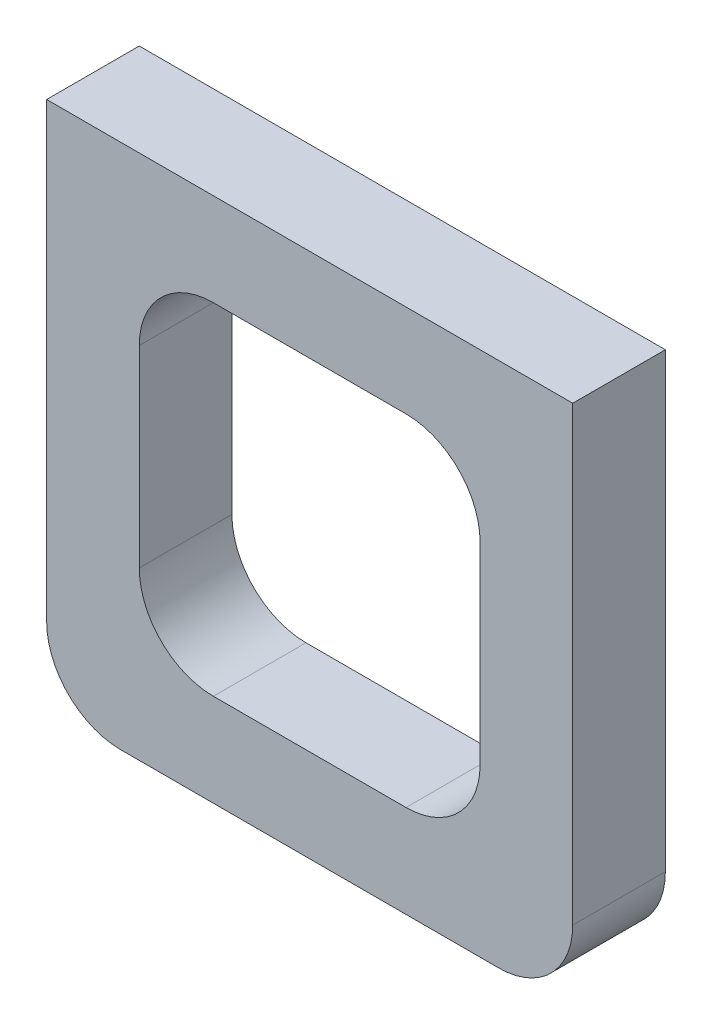
ISO-10303-21;
HEADER;
FILE_DESCRIPTION(('STEP AP214'),'2;1');
FILE_NAME('part.step','',(''),(''),'','','');
FILE_SCHEMA(('AUTOMOTIVE_DESIGN { 1 0 10303 214 1 1 1 1 }'));
ENDSEC;
DATA;
#1=APPLICATION_CONTEXT('core data for automotive mechanical design processes');
#2=APPLICATION_PROTOCOL_DEFINITION('international standard','automotive_design',2000,#1);
#3=PRODUCT_CONTEXT('',#1,'mechanical');
#4=PRODUCT('Part','Part','',(#3));
#5=PRODUCT_RELATED_PRODUCT_CATEGORY('part','',(#4));
#6=PRODUCT_DEFINITION_FORMATION('','',#4);
#7=PRODUCT_DEFINITION_CONTEXT('part definition',#1,'design');
#8=PRODUCT_DEFINITION('design','',#6,#7);
#9=PRODUCT_DEFINITION_SHAPE('','',#8);
#10=(LENGTH_UNIT() NAMED_UNIT(*) SI_UNIT(.MILLI.,.METRE.));
#11=(NAMED_UNIT(*) PLANE_ANGLE_UNIT() SI_UNIT($,.RADIAN.));
#12=(NAMED_UNIT(*) SI_UNIT($,.STERADIAN.) SOLID_ANGLE_UNIT());
#13=UNCERTAINTY_MEASURE_WITH_UNIT(LENGTH_MEASURE(1.E-05),#10,'distance_accuracy_value','');
#14=(GEOMETRIC_REPRESENTATION_CONTEXT(3) GLOBAL_UNCERTAINTY_ASSIGNED_CONTEXT((#13)) GLOBAL_UNIT_ASSIGNED_CONTEXT((#10,
#11,#12)) REPRESENTATION_CONTEXT('',''));
#15=CARTESIAN_POINT('',(0.,0.,0.));
#16=DIRECTION('',(0.,0.,1.));
#17=DIRECTION('',(1.,0.,0.));
#18=AXIS2_PLACEMENT_3D('',#15,#16,#17);
#19=CARTESIAN_POINT('',(5.08,5.08,6.35));
#20=DIRECTION('',(0.,0.,1.));
#21=DIRECTION('',(1.,0.,0.));
#22=AXIS2_PLACEMENT_3D('',#19,#20,#21);
#23=PLANE('',#22);
#24=DIRECTION('',(-1.,0.,0.));
#25=VECTOR('',#24,1.);
#26=CARTESIAN_POINT('',(36.068,36.068,6.35));
#27=LINE('',#26,#25);
#28=CARTESIAN_POINT('',(36.068,36.068,6.35));
#29=VERTEX_POINT('',#28);
#30=CARTESIAN_POINT('',(0.,36.068,6.35));
#31=VERTEX_POINT('',#30);
#32=EDGE_CURVE('E207',#29,#31,#27,.T.);
#33=ORIENTED_EDGE('',*,*,#32,.T.);
#34=DIRECTION('',(0.,-1.,0.));
#35=VECTOR('',#34,1.);
#36=CARTESIAN_POINT('',(0.,5.08000000000004,6.35));
#37=LINE('',#36,#35);
#38=CARTESIAN_POINT('',(0.,5.08000000000004,6.35));
#39=VERTEX_POINT('',#38);
#40=EDGE_CURVE('E210',#31,#39,#37,.T.);
#41=ORIENTED_EDGE('',*,*,#40,.T.);
#42=CARTESIAN_POINT('',(5.08,5.08,6.35));
#43=DIRECTION('',(0.,0.,1.));
#44=DIRECTION('',(1.,0.,0.));
#45=AXIS2_PLACEMENT_3D('',#42,#43,#44);
#46=CIRCLE('',#45,5.08);
#47=CARTESIAN_POINT('',(5.08000000000003,0.,6.35));
#48=VERTEX_POINT('',#47);
#49=EDGE_CURVE('E213',#39,#48,#46,.T.);
#50=ORIENTED_EDGE('',*,*,#49,.T.);
#51=DIRECTION('',(1.,0.,0.));
#52=VECTOR('',#51,1.);
#53=CARTESIAN_POINT('',(30.988,0.,6.35));
#54=LINE('',#53,#52);
#55=CARTESIAN_POINT('',(30.988,0.,6.35));
#56=VERTEX_POINT('',#55);
#57=EDGE_CURVE('E215',#48,#56,#54,.T.);
#58=ORIENTED_EDGE('',*,*,#57,.T.);
#59=CARTESIAN_POINT('',(30.988,5.08,6.35));
#60=DIRECTION('',(0.,0.,1.));
#61=DIRECTION('',(-1.,0.,0.));
#62=AXIS2_PLACEMENT_3D('',#59,#60,#61);
#63=CIRCLE('',#62,5.08);
#64=CARTESIAN_POINT('',(36.068,5.08000000000004,6.35));
#65=VERTEX_POINT('',#64);
#66=EDGE_CURVE('E217',#56,#65,#63,.T.);
#67=ORIENTED_EDGE('',*,*,#66,.T.);
#68=DIRECTION('',(0.,1.,0.));
#69=VECTOR('',#68,1.);
#70=CARTESIAN_POINT('',(36.068,36.068,6.35));
#71=LINE('',#70,#69);
#72=EDGE_CURVE('E219',#65,#29,#71,.T.);
#73=ORIENTED_EDGE('',*,*,#72,.T.);
#74=EDGE_LOOP('',(#33,#41,#50,#58,#67,#73));
#75=FACE_BOUND('',#74,.T.);
#76=DIRECTION('',(1.,0.,0.));
#77=VECTOR('',#76,1.);
#78=CARTESIAN_POINT('',(11.43,6.35,6.35));
#79=LINE('',#78,#77);
#80=CARTESIAN_POINT('',(11.43,6.35,6.35));
#81=VERTEX_POINT('',#80);
#82=CARTESIAN_POINT('',(24.638,6.35,6.35));
#83=VERTEX_POINT('',#82);
#84=EDGE_CURVE('E150',#81,#83,#79,.T.);
#85=ORIENTED_EDGE('',*,*,#84,.F.);
#86=CARTESIAN_POINT('',(11.43,11.43,6.35));
#87=DIRECTION('',(0.,0.,1.));
#88=DIRECTION('',(-1.,0.,0.));
#89=AXIS2_PLACEMENT_3D('',#86,#87,#88);
#90=CIRCLE('',#89,5.08);
#91=CARTESIAN_POINT('',(6.35,11.43,6.35));
#92=VERTEX_POINT('',#91);
#93=EDGE_CURVE('E142',#92,#81,#90,.T.);
#94=ORIENTED_EDGE('',*,*,#93,.F.);
#95=DIRECTION('',(0.,-1.,0.));
#96=VECTOR('',#95,1.);
#97=CARTESIAN_POINT('',(6.35,11.43,6.35));
#98=LINE('',#97,#96);
#99=CARTESIAN_POINT('',(6.35,24.638,6.35));
#100=VERTEX_POINT('',#99);
#101=EDGE_CURVE('E175',#100,#92,#98,.T.);
#102=ORIENTED_EDGE('',*,*,#101,.F.);
#103=CARTESIAN_POINT('',(11.43,24.638,6.35));
#104=DIRECTION('',(0.,0.,1.));
#105=DIRECTION('',(-1.,0.,0.));
#106=AXIS2_PLACEMENT_3D('',#103,#104,#105);
#107=CIRCLE('',#106,5.08);
#108=CARTESIAN_POINT('',(11.43,29.718,6.35));
#109=VERTEX_POINT('',#108);
#110=EDGE_CURVE('E173',#109,#100,#107,.T.);
#111=ORIENTED_EDGE('',*,*,#110,.F.);
#112=DIRECTION('',(-1.,0.,0.));
#113=VECTOR('',#112,1.);
#114=CARTESIAN_POINT('',(11.43,29.718,6.35));
#115=LINE('',#114,#113);
#116=CARTESIAN_POINT('',(24.638,29.718,6.35));
#117=VERTEX_POINT('',#116);
#118=EDGE_CURVE('E171',#117,#109,#115,.T.);
#119=ORIENTED_EDGE('',*,*,#118,.F.);
#120=CARTESIAN_POINT('',(24.638,24.638,6.35));
#121=DIRECTION('',(0.,0.,1.));
#122=DIRECTION('',(-1.,0.,0.));
#123=AXIS2_PLACEMENT_3D('',#120,#121,#122);
#124=CIRCLE('',#123,5.08);
#125=CARTESIAN_POINT('',(29.718,24.638,6.35));
#126=VERTEX_POINT('',#125);
#127=EDGE_CURVE('E169',#126,#117,#124,.T.);
#128=ORIENTED_EDGE('',*,*,#127,.F.);
#129=DIRECTION('',(0.,1.,0.));
#130=VECTOR('',#129,1.);
#131=CARTESIAN_POINT('',(29.718,11.43,6.35));
#132=LINE('',#131,#130);
#133=CARTESIAN_POINT('',(29.718,11.43,6.35));
#134=VERTEX_POINT('',#133);
#135=EDGE_CURVE('E165',#134,#126,#132,.T.);
#136=ORIENTED_EDGE('',*,*,#135,.F.);
#137=CARTESIAN_POINT('',(24.638,11.43,6.35));
#138=DIRECTION('',(0.,0.,1.));
#139=DIRECTION('',(1.,0.,0.));
#140=AXIS2_PLACEMENT_3D('',#137,#138,#139);
#141=CIRCLE('',#140,5.08);
#142=EDGE_CURVE('E163',#83,#134,#141,.T.);
#143=ORIENTED_EDGE('',*,*,#142,.F.);
#144=EDGE_LOOP('',(#85,#94,#102,#111,#119,#128,#136,#143));
#145=FACE_BOUND('',#144,.T.);
#146=ADVANCED_FACE('F41',(#75,#145),#23,.T.);
#147=CARTESIAN_POINT('',(5.08,5.08,0.));
#148=DIRECTION('',(0.,0.,1.));
#149=DIRECTION('',(1.,0.,0.));
#150=AXIS2_PLACEMENT_3D('',#147,#148,#149);
#151=PLANE('',#150);
#152=DIRECTION('',(-1.,0.,0.));
#153=VECTOR('',#152,1.);
#154=CARTESIAN_POINT('',(36.068,36.068,0.));
#155=LINE('',#154,#153);
#156=CARTESIAN_POINT('',(36.068,36.068,0.));
#157=VERTEX_POINT('',#156);
#158=CARTESIAN_POINT('',(0.,36.068,0.));
#159=VERTEX_POINT('',#158);
#160=EDGE_CURVE('E158',#157,#159,#155,.T.);
#161=ORIENTED_EDGE('',*,*,#160,.F.);
#162=DIRECTION('',(0.,1.,0.));
#163=VECTOR('',#162,1.);
#164=CARTESIAN_POINT('',(36.068,36.068,0.));
#165=LINE('',#164,#163);
#166=CARTESIAN_POINT('',(36.068,5.08000000000004,0.));
#167=VERTEX_POINT('',#166);
#168=EDGE_CURVE('E211',#167,#157,#165,.T.);
#169=ORIENTED_EDGE('',*,*,#168,.F.);
#170=CARTESIAN_POINT('',(30.988,5.08,0.));
#171=DIRECTION('',(0.,0.,1.));
#172=DIRECTION('',(-1.,0.,0.));
#173=AXIS2_PLACEMENT_3D('',#170,#171,#172);
#174=CIRCLE('',#173,5.08);
#175=CARTESIAN_POINT('',(30.988,0.,0.));
#176=VERTEX_POINT('',#175);
#177=EDGE_CURVE('E230',#176,#167,#174,.T.);
#178=ORIENTED_EDGE('',*,*,#177,.F.);
#179=DIRECTION('',(1.,0.,0.));
#180=VECTOR('',#179,1.);
#181=CARTESIAN_POINT('',(30.988,0.,0.));
#182=LINE('',#181,#180);
#183=CARTESIAN_POINT('',(5.08000000000003,0.,0.));
#184=VERTEX_POINT('',#183);
#185=EDGE_CURVE('E228',#184,#176,#182,.T.);
#186=ORIENTED_EDGE('',*,*,#185,.F.);
#187=CARTESIAN_POINT('',(5.08,5.08,0.));
#188=DIRECTION('',(0.,0.,1.));
#189=DIRECTION('',(1.,0.,0.));
#190=AXIS2_PLACEMENT_3D('',#187,#188,#189);
#191=CIRCLE('',#190,5.08);
#192=CARTESIAN_POINT('',(0.,5.08000000000004,0.));
#193=VERTEX_POINT('',#192);
#194=EDGE_CURVE('E226',#193,#184,#191,.T.);
#195=ORIENTED_EDGE('',*,*,#194,.F.);
#196=DIRECTION('',(0.,-1.,0.));
#197=VECTOR('',#196,1.);
#198=CARTESIAN_POINT('',(0.,5.08000000000004,0.));
#199=LINE('',#198,#197);
#200=EDGE_CURVE('E224',#159,#193,#199,.T.);
#201=ORIENTED_EDGE('',*,*,#200,.F.);
#202=EDGE_LOOP('',(#161,#169,#178,#186,#195,#201));
#203=FACE_BOUND('',#202,.T.);
#204=CARTESIAN_POINT('',(11.43,11.43,0.));
#205=DIRECTION('',(0.,0.,1.));
#206=DIRECTION('',(-1.,0.,0.));
#207=AXIS2_PLACEMENT_3D('',#204,#205,#206);
#208=CIRCLE('',#207,5.08);
#209=CARTESIAN_POINT('',(6.35,11.43,0.));
#210=VERTEX_POINT('',#209);
#211=CARTESIAN_POINT('',(11.43,6.35,0.));
#212=VERTEX_POINT('',#211);
#213=EDGE_CURVE('E64',#210,#212,#208,.T.);
#214=ORIENTED_EDGE('',*,*,#213,.T.);
#215=DIRECTION('',(1.,0.,0.));
#216=VECTOR('',#215,1.);
#217=CARTESIAN_POINT('',(11.43,6.35,0.));
#218=LINE('',#217,#216);
#219=CARTESIAN_POINT('',(24.638,6.35,0.));
#220=VERTEX_POINT('',#219);
#221=EDGE_CURVE('E157',#212,#220,#218,.T.);
#222=ORIENTED_EDGE('',*,*,#221,.T.);
#223=CARTESIAN_POINT('',(24.638,11.43,0.));
#224=DIRECTION('',(0.,0.,1.));
#225=DIRECTION('',(1.,0.,0.));
#226=AXIS2_PLACEMENT_3D('',#223,#224,#225);
#227=CIRCLE('',#226,5.08);
#228=CARTESIAN_POINT('',(29.718,11.43,0.));
#229=VERTEX_POINT('',#228);
#230=EDGE_CURVE('E179',#220,#229,#227,.T.);
#231=ORIENTED_EDGE('',*,*,#230,.T.);
#232=DIRECTION('',(0.,1.,0.));
#233=VECTOR('',#232,1.);
#234=CARTESIAN_POINT('',(29.718,11.43,0.));
#235=LINE('',#234,#233);
#236=CARTESIAN_POINT('',(29.718,24.638,0.));
#237=VERTEX_POINT('',#236);
#238=EDGE_CURVE('E182',#229,#237,#235,.T.);
#239=ORIENTED_EDGE('',*,*,#238,.T.);
#240=CARTESIAN_POINT('',(24.638,24.638,0.));
#241=DIRECTION('',(0.,0.,1.));
#242=DIRECTION('',(-1.,0.,0.));
#243=AXIS2_PLACEMENT_3D('',#240,#241,#242);
#244=CIRCLE('',#243,5.08);
#245=CARTESIAN_POINT('',(24.638,29.718,0.));
#246=VERTEX_POINT('',#245);
#247=EDGE_CURVE('E185',#237,#246,#244,.T.);
#248=ORIENTED_EDGE('',*,*,#247,.T.);
#249=DIRECTION('',(-1.,0.,0.));
#250=VECTOR('',#249,1.);
#251=CARTESIAN_POINT('',(11.43,29.718,0.));
#252=LINE('',#251,#250);
#253=CARTESIAN_POINT('',(11.43,29.718,0.));
#254=VERTEX_POINT('',#253);
#255=EDGE_CURVE('E188',#246,#254,#252,.T.);
#256=ORIENTED_EDGE('',*,*,#255,.T.);
#257=CARTESIAN_POINT('',(11.43,24.638,0.));
#258=DIRECTION('',(0.,0.,1.));
#259=DIRECTION('',(-1.,0.,0.));
#260=AXIS2_PLACEMENT_3D('',#257,#258,#259);
#261=CIRCLE('',#260,5.08);
#262=CARTESIAN_POINT('',(6.35,24.638,0.));
#263=VERTEX_POINT('',#262);
#264=EDGE_CURVE('E191',#254,#263,#261,.T.);
#265=ORIENTED_EDGE('',*,*,#264,.T.);
#266=DIRECTION('',(0.,-1.,0.));
#267=VECTOR('',#266,1.);
#268=CARTESIAN_POINT('',(6.35,11.43,0.));
#269=LINE('',#268,#267);
#270=EDGE_CURVE('E151',#263,#210,#269,.T.);
#271=ORIENTED_EDGE('',*,*,#270,.T.);
#272=EDGE_LOOP('',(#214,#222,#231,#239,#248,#256,#265,#271));
#273=FACE_BOUND('',#272,.T.);
#274=ADVANCED_FACE('F254',(#203,#273),#151,.F.);
#275=CARTESIAN_POINT('',(36.068,36.068,6.35));
#276=DIRECTION('',(0.,-1.,0.));
#277=DIRECTION('',(1.,0.,0.));
#278=AXIS2_PLACEMENT_3D('',#275,#276,#277);
#279=PLANE('',#278);
#280=ORIENTED_EDGE('',*,*,#160,.T.);
#281=DIRECTION('',(0.,0.,-1.));
#282=VECTOR('',#281,1.);
#283=CARTESIAN_POINT('',(0.,36.068,6.35));
#284=LINE('',#283,#282);
#285=EDGE_CURVE('E11',#31,#159,#284,.T.);
#286=ORIENTED_EDGE('',*,*,#285,.F.);
#287=ORIENTED_EDGE('',*,*,#32,.F.);
#288=DIRECTION('',(0.,0.,-1.));
#289=VECTOR('',#288,1.);
#290=CARTESIAN_POINT('',(36.068,36.068,6.35));
#291=LINE('',#290,#289);
#292=EDGE_CURVE('E221',#29,#157,#291,.T.);
#293=ORIENTED_EDGE('',*,*,#292,.T.);
#294=EDGE_LOOP('',(#280,#286,#287,#293));
#295=FACE_BOUND('',#294,.T.);
#296=ADVANCED_FACE('F43',(#295),#279,.F.);
#297=CARTESIAN_POINT('',(0.,5.08000000000004,6.35));
#298=DIRECTION('',(1.,0.,0.));
#299=DIRECTION('',(0.,0.,-1.));
#300=AXIS2_PLACEMENT_3D('',#297,#298,#299);
#301=PLANE('',#300);
#302=ORIENTED_EDGE('',*,*,#200,.T.);
#303=DIRECTION('',(0.,0.,-1.));
#304=VECTOR('',#303,1.);
#305=CARTESIAN_POINT('',(0.,5.08000000000004,6.35));
#306=LINE('',#305,#304);
#307=EDGE_CURVE('E49',#39,#193,#306,.T.);
#308=ORIENTED_EDGE('',*,*,#307,.F.);
#309=ORIENTED_EDGE('',*,*,#40,.F.);
#310=ORIENTED_EDGE('',*,*,#285,.T.);
#311=EDGE_LOOP('',(#302,#308,#309,#310));
#312=FACE_BOUND('',#311,.T.);
#313=ADVANCED_FACE('F271',(#312),#301,.F.);
#314=CARTESIAN_POINT('',(5.08,5.08,6.35));
#315=DIRECTION('',(0.,0.,-1.));
#316=DIRECTION('',(-1.,0.,0.));
#317=AXIS2_PLACEMENT_3D('',#314,#315,#316);
#318=CYLINDRICAL_SURFACE('',#317,5.08);
#319=ORIENTED_EDGE('',*,*,#194,.T.);
#320=DIRECTION('',(0.,0.,-1.));
#321=VECTOR('',#320,1.);
#322=CARTESIAN_POINT('',(5.08000000000003,0.,6.35));
#323=LINE('',#322,#321);
#324=EDGE_CURVE('E241',#48,#184,#323,.T.);
#325=ORIENTED_EDGE('',*,*,#324,.F.);
#326=ORIENTED_EDGE('',*,*,#49,.F.);
#327=ORIENTED_EDGE('',*,*,#307,.T.);
#328=EDGE_LOOP('',(#319,#325,#326,#327));
#329=FACE_BOUND('',#328,.T.);
#330=ADVANCED_FACE('F248',(#329),#318,.T.);
#331=CARTESIAN_POINT('',(30.988,0.,6.35));
#332=DIRECTION('',(0.,1.,0.));
#333=DIRECTION('',(-1.,0.,0.));
#334=AXIS2_PLACEMENT_3D('',#331,#332,#333);
#335=PLANE('',#334);
#336=ORIENTED_EDGE('',*,*,#185,.T.);
#337=DIRECTION('',(0.,0.,-1.));
#338=VECTOR('',#337,1.);
#339=CARTESIAN_POINT('',(30.988,0.,6.35));
#340=LINE('',#339,#338);
#341=EDGE_CURVE('E238',#56,#176,#340,.T.);
#342=ORIENTED_EDGE('',*,*,#341,.F.);
#343=ORIENTED_EDGE('',*,*,#57,.F.);
#344=ORIENTED_EDGE('',*,*,#324,.T.);
#345=EDGE_LOOP('',(#336,#342,#343,#344));
#346=FACE_BOUND('',#345,.T.);
#347=ADVANCED_FACE('F260',(#346),#335,.F.);
#348=CARTESIAN_POINT('',(30.988,5.08,6.35));
#349=DIRECTION('',(0.,0.,-1.));
#350=DIRECTION('',(-1.,0.,0.));
#351=AXIS2_PLACEMENT_3D('',#348,#349,#350);
#352=CYLINDRICAL_SURFACE('',#351,5.08);
#353=ORIENTED_EDGE('',*,*,#177,.T.);
#354=DIRECTION('',(0.,0.,-1.));
#355=VECTOR('',#354,1.);
#356=CARTESIAN_POINT('',(36.068,5.08000000000004,6.35));
#357=LINE('',#356,#355);
#358=EDGE_CURVE('E235',#65,#167,#357,.T.);
#359=ORIENTED_EDGE('',*,*,#358,.F.);
#360=ORIENTED_EDGE('',*,*,#66,.F.);
#361=ORIENTED_EDGE('',*,*,#341,.T.);
#362=EDGE_LOOP('',(#353,#359,#360,#361));
#363=FACE_BOUND('',#362,.T.);
#364=ADVANCED_FACE('F264',(#363),#352,.T.);
#365=CARTESIAN_POINT('',(36.068,36.068,6.35));
#366=DIRECTION('',(-1.,0.,0.));
#367=DIRECTION('',(0.,-1.,0.));
#368=AXIS2_PLACEMENT_3D('',#365,#366,#367);
#369=PLANE('',#368);
#370=ORIENTED_EDGE('',*,*,#168,.T.);
#371=ORIENTED_EDGE('',*,*,#292,.F.);
#372=ORIENTED_EDGE('',*,*,#72,.F.);
#373=ORIENTED_EDGE('',*,*,#358,.T.);
#374=EDGE_LOOP('',(#370,#371,#372,#373));
#375=FACE_BOUND('',#374,.T.);
#376=ADVANCED_FACE('F274',(#375),#369,.F.);
#377=CARTESIAN_POINT('',(11.43,11.43,6.35));
#378=DIRECTION('',(0.,0.,-1.));
#379=DIRECTION('',(-1.,0.,0.));
#380=AXIS2_PLACEMENT_3D('',#377,#378,#379);
#381=CYLINDRICAL_SURFACE('',#380,5.08);
#382=ORIENTED_EDGE('',*,*,#213,.F.);
#383=DIRECTION('',(0.,0.,-1.));
#384=VECTOR('',#383,1.);
#385=CARTESIAN_POINT('',(6.35,11.43,6.35));
#386=LINE('',#385,#384);
#387=EDGE_CURVE('E146',#92,#210,#386,.T.);
#388=ORIENTED_EDGE('',*,*,#387,.F.);
#389=ORIENTED_EDGE('',*,*,#93,.T.);
#390=DIRECTION('',(0.,0.,-1.));
#391=VECTOR('',#390,1.);
#392=CARTESIAN_POINT('',(11.43,6.35,6.35));
#393=LINE('',#392,#391);
#394=EDGE_CURVE('E145',#81,#212,#393,.T.);
#395=ORIENTED_EDGE('',*,*,#394,.T.);
#396=EDGE_LOOP('',(#382,#388,#389,#395));
#397=FACE_BOUND('',#396,.T.);
#398=ADVANCED_FACE('F144',(#397),#381,.F.);
#399=CARTESIAN_POINT('',(11.43,6.35,6.35));
#400=DIRECTION('',(0.,1.,0.));
#401=DIRECTION('',(-1.,0.,0.));
#402=AXIS2_PLACEMENT_3D('',#399,#400,#401);
#403=PLANE('',#402);
#404=ORIENTED_EDGE('',*,*,#221,.F.);
#405=ORIENTED_EDGE('',*,*,#394,.F.);
#406=ORIENTED_EDGE('',*,*,#84,.T.);
#407=DIRECTION('',(0.,0.,-1.));
#408=VECTOR('',#407,1.);
#409=CARTESIAN_POINT('',(24.638,6.35,6.35));
#410=LINE('',#409,#408);
#411=EDGE_CURVE('E159',#83,#220,#410,.T.);
#412=ORIENTED_EDGE('',*,*,#411,.T.);
#413=EDGE_LOOP('',(#404,#405,#406,#412));
#414=FACE_BOUND('',#413,.T.);
#415=ADVANCED_FACE('F154',(#414),#403,.T.);
#416=CARTESIAN_POINT('',(24.638,11.43,6.35));
#417=DIRECTION('',(0.,0.,-1.));
#418=DIRECTION('',(-1.,0.,0.));
#419=AXIS2_PLACEMENT_3D('',#416,#417,#418);
#420=CYLINDRICAL_SURFACE('',#419,5.08);
#421=ORIENTED_EDGE('',*,*,#230,.F.);
#422=ORIENTED_EDGE('',*,*,#411,.F.);
#423=ORIENTED_EDGE('',*,*,#142,.T.);
#424=DIRECTION('',(0.,0.,-1.));
#425=VECTOR('',#424,1.);
#426=CARTESIAN_POINT('',(29.718,11.43,6.35));
#427=LINE('',#426,#425);
#428=EDGE_CURVE('E204',#134,#229,#427,.T.);
#429=ORIENTED_EDGE('',*,*,#428,.T.);
#430=EDGE_LOOP('',(#421,#422,#423,#429));
#431=FACE_BOUND('',#430,.T.);
#432=ADVANCED_FACE('F292',(#431),#420,.F.);
#433=CARTESIAN_POINT('',(29.718,11.43,6.35));
#434=DIRECTION('',(-1.,0.,0.));
#435=DIRECTION('',(0.,0.,1.));
#436=AXIS2_PLACEMENT_3D('',#433,#434,#435);
#437=PLANE('',#436);
#438=ORIENTED_EDGE('',*,*,#238,.F.);
#439=ORIENTED_EDGE('',*,*,#428,.F.);
#440=ORIENTED_EDGE('',*,*,#135,.T.);
#441=DIRECTION('',(0.,0.,-1.));
#442=VECTOR('',#441,1.);
#443=CARTESIAN_POINT('',(29.718,24.638,6.35));
#444=LINE('',#443,#442);
#445=EDGE_CURVE('E202',#126,#237,#444,.T.);
#446=ORIENTED_EDGE('',*,*,#445,.T.);
#447=EDGE_LOOP('',(#438,#439,#440,#446));
#448=FACE_BOUND('',#447,.T.);
#449=ADVANCED_FACE('F295',(#448),#437,.T.);
#450=CARTESIAN_POINT('',(24.638,24.638,6.35));
#451=DIRECTION('',(0.,0.,-1.));
#452=DIRECTION('',(-1.,0.,0.));
#453=AXIS2_PLACEMENT_3D('',#450,#451,#452);
#454=CYLINDRICAL_SURFACE('',#453,5.08);
#455=ORIENTED_EDGE('',*,*,#247,.F.);
#456=ORIENTED_EDGE('',*,*,#445,.F.);
#457=ORIENTED_EDGE('',*,*,#127,.T.);
#458=DIRECTION('',(0.,0.,-1.));
#459=VECTOR('',#458,1.);
#460=CARTESIAN_POINT('',(24.638,29.718,6.35));
#461=LINE('',#460,#459);
#462=EDGE_CURVE('E200',#117,#246,#461,.T.);
#463=ORIENTED_EDGE('',*,*,#462,.T.);
#464=EDGE_LOOP('',(#455,#456,#457,#463));
#465=FACE_BOUND('',#464,.T.);
#466=ADVANCED_FACE('F299',(#465),#454,.F.);
#467=CARTESIAN_POINT('',(11.43,29.718,6.35));
#468=DIRECTION('',(0.,-1.,0.));
#469=DIRECTION('',(0.,0.,-1.));
#470=AXIS2_PLACEMENT_3D('',#467,#468,#469);
#471=PLANE('',#470);
#472=ORIENTED_EDGE('',*,*,#255,.F.);
#473=ORIENTED_EDGE('',*,*,#462,.F.);
#474=ORIENTED_EDGE('',*,*,#118,.T.);
#475=DIRECTION('',(0.,0.,-1.));
#476=VECTOR('',#475,1.);
#477=CARTESIAN_POINT('',(11.43,29.718,6.35));
#478=LINE('',#477,#476);
#479=EDGE_CURVE('E198',#109,#254,#478,.T.);
#480=ORIENTED_EDGE('',*,*,#479,.T.);
#481=EDGE_LOOP('',(#472,#473,#474,#480));
#482=FACE_BOUND('',#481,.T.);
#483=ADVANCED_FACE('F303',(#482),#471,.T.);
#484=CARTESIAN_POINT('',(11.43,24.638,6.35));
#485=DIRECTION('',(0.,0.,-1.));
#486=DIRECTION('',(-1.,0.,0.));
#487=AXIS2_PLACEMENT_3D('',#484,#485,#486);
#488=CYLINDRICAL_SURFACE('',#487,5.08);
#489=ORIENTED_EDGE('',*,*,#264,.F.);
#490=ORIENTED_EDGE('',*,*,#479,.F.);
#491=ORIENTED_EDGE('',*,*,#110,.T.);
#492=DIRECTION('',(0.,0.,-1.));
#493=VECTOR('',#492,1.);
#494=CARTESIAN_POINT('',(6.35,24.638,6.35));
#495=LINE('',#494,#493);
#496=EDGE_CURVE('E56',#100,#263,#495,.T.);
#497=ORIENTED_EDGE('',*,*,#496,.T.);
#498=EDGE_LOOP('',(#489,#490,#491,#497));
#499=FACE_BOUND('',#498,.T.);
#500=ADVANCED_FACE('F307',(#499),#488,.F.);
#501=CARTESIAN_POINT('',(6.35,11.43,6.35));
#502=DIRECTION('',(1.,0.,0.));
#503=DIRECTION('',(0.,0.,-1.));
#504=AXIS2_PLACEMENT_3D('',#501,#502,#503);
#505=PLANE('',#504);
#506=ORIENTED_EDGE('',*,*,#270,.F.);
#507=ORIENTED_EDGE('',*,*,#496,.F.);
#508=ORIENTED_EDGE('',*,*,#101,.T.);
#509=ORIENTED_EDGE('',*,*,#387,.T.);
#510=EDGE_LOOP('',(#506,#507,#508,#509));
#511=FACE_BOUND('',#510,.T.);
#512=ADVANCED_FACE('F311',(#511),#505,.T.);
#513=CLOSED_SHELL('',(#146,#274,#296,#313,#330,#347,#364,#376,#398,#415,#432,#449,#466,#483,
#500,#512));
#514=MANIFOLD_SOLID_BREP('B2',#513);
#515=ADVANCED_BREP_SHAPE_REPRESENTATION('',(#18,#514),#14);
#516=SHAPE_DEFINITION_REPRESENTATION(#9,#515);
ENDSEC;
END-ISO-10303-21;
